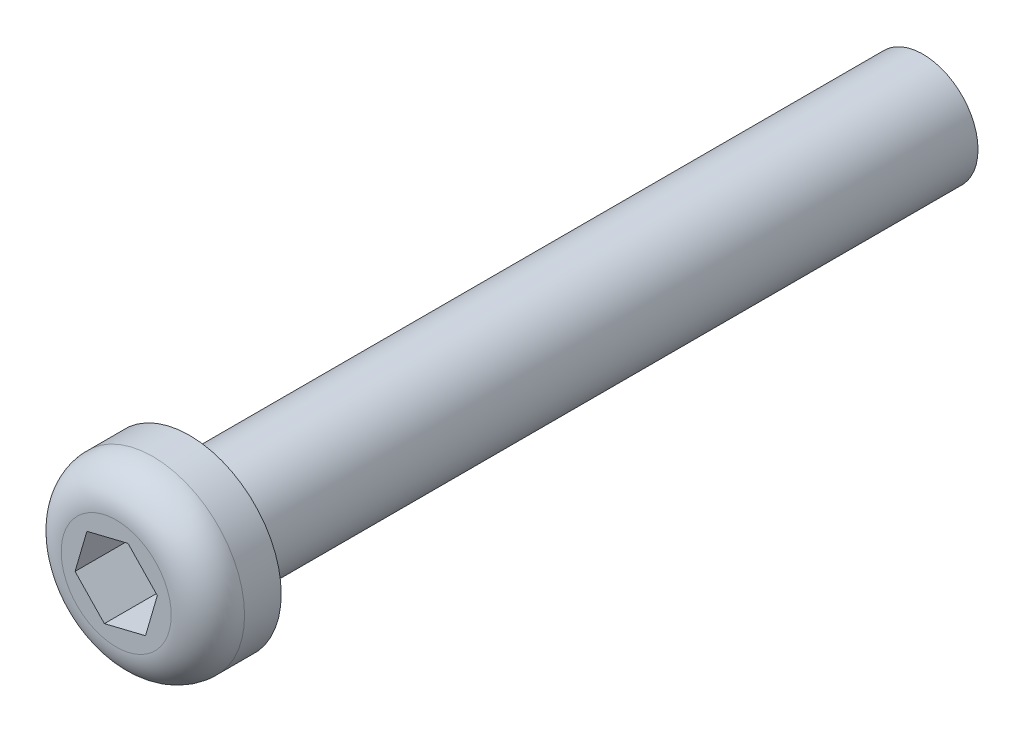
ISO-10303-21;
HEADER;
FILE_DESCRIPTION(('STEP AP214'),'2;1');
FILE_NAME('part.step','',(''),(''),'','','');
FILE_SCHEMA(('AUTOMOTIVE_DESIGN { 1 0 10303 214 1 1 1 1 }'));
ENDSEC;
DATA;
#1=APPLICATION_CONTEXT('core data for automotive mechanical design processes');
#2=APPLICATION_PROTOCOL_DEFINITION('international standard','automotive_design',2000,#1);
#3=PRODUCT_CONTEXT('',#1,'mechanical');
#4=PRODUCT('Part','Part','',(#3));
#5=PRODUCT_RELATED_PRODUCT_CATEGORY('part','',(#4));
#6=PRODUCT_DEFINITION_FORMATION('','',#4);
#7=PRODUCT_DEFINITION_CONTEXT('part definition',#1,'design');
#8=PRODUCT_DEFINITION('design','',#6,#7);
#9=PRODUCT_DEFINITION_SHAPE('','',#8);
#10=(LENGTH_UNIT() NAMED_UNIT(*) SI_UNIT(.MILLI.,.METRE.));
#11=(NAMED_UNIT(*) PLANE_ANGLE_UNIT() SI_UNIT($,.RADIAN.));
#12=(NAMED_UNIT(*) SI_UNIT($,.STERADIAN.) SOLID_ANGLE_UNIT());
#13=UNCERTAINTY_MEASURE_WITH_UNIT(LENGTH_MEASURE(1.E-05),#10,'distance_accuracy_value','');
#14=(GEOMETRIC_REPRESENTATION_CONTEXT(3) GLOBAL_UNCERTAINTY_ASSIGNED_CONTEXT((#13)) GLOBAL_UNIT_ASSIGNED_CONTEXT((#10,
#11,#12)) REPRESENTATION_CONTEXT('',''));
#15=CARTESIAN_POINT('',(0.,0.,0.));
#16=DIRECTION('',(0.,0.,1.));
#17=DIRECTION('',(1.,0.,0.));
#18=AXIS2_PLACEMENT_3D('',#15,#16,#17);
#19=CARTESIAN_POINT('',(0.,0.,20.));
#20=DIRECTION('',(0.,0.,-1.));
#21=DIRECTION('',(-1.,0.,0.));
#22=AXIS2_PLACEMENT_3D('',#19,#20,#21);
#23=CYLINDRICAL_SURFACE('',#22,1.5);
#24=CARTESIAN_POINT('',(0.,0.,20.));
#25=DIRECTION('',(0.,0.,1.));
#26=DIRECTION('',(1.,0.,0.));
#27=AXIS2_PLACEMENT_3D('',#24,#25,#26);
#28=CIRCLE('',#27,1.5);
#29=CARTESIAN_POINT('',(1.5,0.,20.));
#30=VERTEX_POINT('',#29);
#31=EDGE_CURVE('E168',#30,#30,#28,.T.);
#32=ORIENTED_EDGE('',*,*,#31,.F.);
#33=EDGE_LOOP('',(#32));
#34=FACE_BOUND('',#33,.T.);
#35=CARTESIAN_POINT('',(0.,0.,0.));
#36=DIRECTION('',(0.,0.,1.));
#37=DIRECTION('',(1.,0.,0.));
#38=AXIS2_PLACEMENT_3D('',#35,#36,#37);
#39=CIRCLE('',#38,1.5);
#40=CARTESIAN_POINT('',(1.5,0.,0.));
#41=VERTEX_POINT('',#40);
#42=EDGE_CURVE('E167',#41,#41,#39,.T.);
#43=ORIENTED_EDGE('',*,*,#42,.T.);
#44=EDGE_LOOP('',(#43));
#45=FACE_BOUND('',#44,.T.);
#46=ADVANCED_FACE('F39',(#34,#45),#23,.T.);
#47=CARTESIAN_POINT('',(0.,0.,0.));
#48=DIRECTION('',(0.,0.,1.));
#49=DIRECTION('',(1.,0.,0.));
#50=AXIS2_PLACEMENT_3D('',#47,#48,#49);
#51=PLANE('',#50);
#52=ORIENTED_EDGE('',*,*,#42,.F.);
#53=EDGE_LOOP('',(#52));
#54=FACE_BOUND('',#53,.T.);
#55=ADVANCED_FACE('F190',(#54),#51,.F.);
#56=CARTESIAN_POINT('',(0.,0.,22.));
#57=DIRECTION('',(0.,0.,-1.));
#58=DIRECTION('',(-1.,0.,0.));
#59=AXIS2_PLACEMENT_3D('',#56,#57,#58);
#60=CYLINDRICAL_SURFACE('',#59,2.5);
#61=CARTESIAN_POINT('',(0.,0.,21.));
#62=DIRECTION('',(0.,0.,1.));
#63=DIRECTION('',(1.,0.,0.));
#64=AXIS2_PLACEMENT_3D('',#61,#62,#63);
#65=CIRCLE('',#64,2.5);
#66=CARTESIAN_POINT('',(2.5,0.,21.));
#67=VERTEX_POINT('',#66);
#68=EDGE_CURVE('E11',#67,#67,#65,.F.);
#69=ORIENTED_EDGE('',*,*,#68,.T.);
#70=EDGE_LOOP('',(#69));
#71=FACE_BOUND('',#70,.T.);
#72=CARTESIAN_POINT('',(0.,0.,20.));
#73=DIRECTION('',(0.,0.,1.));
#74=DIRECTION('',(1.,0.,0.));
#75=AXIS2_PLACEMENT_3D('',#72,#73,#74);
#76=CIRCLE('',#75,2.5);
#77=CARTESIAN_POINT('',(2.5,0.,20.));
#78=VERTEX_POINT('',#77);
#79=EDGE_CURVE('E154',#78,#78,#76,.T.);
#80=ORIENTED_EDGE('',*,*,#79,.T.);
#81=EDGE_LOOP('',(#80));
#82=FACE_BOUND('',#81,.T.);
#83=ADVANCED_FACE('F195',(#71,#82),#60,.T.);
#84=CARTESIAN_POINT('',(0.,0.,22.));
#85=DIRECTION('',(0.,0.,1.));
#86=DIRECTION('',(1.,0.,0.));
#87=AXIS2_PLACEMENT_3D('',#84,#85,#86);
#88=PLANE('',#87);
#89=CARTESIAN_POINT('',(0.,0.,22.));
#90=DIRECTION('',(0.,0.,1.));
#91=DIRECTION('',(1.,0.,0.));
#92=AXIS2_PLACEMENT_3D('',#89,#90,#91);
#93=CIRCLE('',#92,1.5);
#94=CARTESIAN_POINT('',(1.5,0.,22.));
#95=VERTEX_POINT('',#94);
#96=EDGE_CURVE('E48',#95,#95,#93,.T.);
#97=ORIENTED_EDGE('',*,*,#96,.T.);
#98=EDGE_LOOP('',(#97));
#99=FACE_BOUND('',#98,.T.);
#100=DIRECTION('',(-0.691890801315472,0.722002160007181,0.));
#101=VECTOR('',#100,1.);
#102=CARTESIAN_POINT('',(1.12146550039649,0.275042659879835,22.));
#103=LINE('',#102,#101);
#104=CARTESIAN_POINT('',(1.12146550039649,0.275042659879835,22.));
#105=VERTEX_POINT('',#104);
#106=CARTESIAN_POINT('',(0.322538819617867,1.10873894275111,22.));
#107=VERTEX_POINT('',#106);
#108=EDGE_CURVE('E55',#105,#107,#103,.T.);
#109=ORIENTED_EDGE('',*,*,#108,.F.);
#110=DIRECTION('',(0.279326811495719,0.960196090587561,0.));
#111=VECTOR('',#110,1.);
#112=CARTESIAN_POINT('',(0.798926680778627,-0.833696282871273,22.));
#113=LINE('',#112,#111);
#114=CARTESIAN_POINT('',(0.798926680778627,-0.833696282871273,22.));
#115=VERTEX_POINT('',#114);
#116=EDGE_CURVE('E148',#115,#105,#113,.T.);
#117=ORIENTED_EDGE('',*,*,#116,.F.);
#118=DIRECTION('',(0.971217612811191,0.23819393058038,0.));
#119=VECTOR('',#118,1.);
#120=CARTESIAN_POINT('',(-0.322538819617868,-1.10873894275111,22.));
#121=LINE('',#120,#119);
#122=CARTESIAN_POINT('',(-0.322538819617868,-1.10873894275111,22.));
#123=VERTEX_POINT('',#122);
#124=EDGE_CURVE('E145',#123,#115,#121,.T.);
#125=ORIENTED_EDGE('',*,*,#124,.F.);
#126=DIRECTION('',(0.691890801315472,-0.72200216000718,0.));
#127=VECTOR('',#126,1.);
#128=CARTESIAN_POINT('',(-1.12146550039649,-0.275042659879836,22.));
#129=LINE('',#128,#127);
#130=CARTESIAN_POINT('',(-1.12146550039649,-0.275042659879836,22.));
#131=VERTEX_POINT('',#130);
#132=EDGE_CURVE('E103',#131,#123,#129,.T.);
#133=ORIENTED_EDGE('',*,*,#132,.F.);
#134=DIRECTION('',(-0.279326811495719,-0.960196090587561,0.));
#135=VECTOR('',#134,1.);
#136=CARTESIAN_POINT('',(-0.798926680778626,0.833696282871275,22.));
#137=LINE('',#136,#135);
#138=CARTESIAN_POINT('',(-0.798926680778626,0.833696282871275,22.));
#139=VERTEX_POINT('',#138);
#140=EDGE_CURVE('E139',#139,#131,#137,.T.);
#141=ORIENTED_EDGE('',*,*,#140,.F.);
#142=DIRECTION('',(-0.971217612811191,-0.23819393058038,0.));
#143=VECTOR('',#142,1.);
#144=CARTESIAN_POINT('',(0.322538819617867,1.10873894275111,22.));
#145=LINE('',#144,#143);
#146=EDGE_CURVE('E135',#107,#139,#145,.T.);
#147=ORIENTED_EDGE('',*,*,#146,.F.);
#148=EDGE_LOOP('',(#109,#117,#125,#133,#141,#147));
#149=FACE_BOUND('',#148,.T.);
#150=ADVANCED_FACE('F178',(#99,#149),#88,.T.);
#151=CARTESIAN_POINT('',(0.,0.,20.));
#152=DIRECTION('',(0.,0.,1.));
#153=DIRECTION('',(1.,0.,0.));
#154=AXIS2_PLACEMENT_3D('',#151,#152,#153);
#155=PLANE('',#154);
#156=ORIENTED_EDGE('',*,*,#31,.T.);
#157=EDGE_LOOP('',(#156));
#158=FACE_BOUND('',#157,.T.);
#159=ORIENTED_EDGE('',*,*,#79,.F.);
#160=EDGE_LOOP('',(#159));
#161=FACE_BOUND('',#160,.T.);
#162=ADVANCED_FACE('F204',(#158,#161),#155,.F.);
#163=CARTESIAN_POINT('',(1.12146550039649,0.275042659879835,20.5));
#164=DIRECTION('',(0.722002160007181,0.691890801315472,0.));
#165=DIRECTION('',(-0.691890801315472,0.722002160007181,0.));
#166=AXIS2_PLACEMENT_3D('',#163,#164,#165);
#167=PLANE('',#166);
#168=ORIENTED_EDGE('',*,*,#108,.T.);
#169=DIRECTION('',(0.,0.,1.));
#170=VECTOR('',#169,1.);
#171=CARTESIAN_POINT('',(0.322538819617867,1.10873894275111,20.5));
#172=LINE('',#171,#170);
#173=CARTESIAN_POINT('',(0.322538819617867,1.10873894275111,20.5));
#174=VERTEX_POINT('',#173);
#175=EDGE_CURVE('E85',#174,#107,#172,.T.);
#176=ORIENTED_EDGE('',*,*,#175,.F.);
#177=DIRECTION('',(-0.691890801315472,0.722002160007181,0.));
#178=VECTOR('',#177,1.);
#179=CARTESIAN_POINT('',(1.12146550039649,0.275042659879835,20.5));
#180=LINE('',#179,#178);
#181=CARTESIAN_POINT('',(1.12146550039649,0.275042659879835,20.5));
#182=VERTEX_POINT('',#181);
#183=EDGE_CURVE('E151',#182,#174,#180,.T.);
#184=ORIENTED_EDGE('',*,*,#183,.F.);
#185=DIRECTION('',(0.,0.,1.));
#186=VECTOR('',#185,1.);
#187=CARTESIAN_POINT('',(1.12146550039649,0.275042659879835,20.5));
#188=LINE('',#187,#186);
#189=EDGE_CURVE('E63',#182,#105,#188,.T.);
#190=ORIENTED_EDGE('',*,*,#189,.T.);
#191=EDGE_LOOP('',(#168,#176,#184,#190));
#192=FACE_BOUND('',#191,.T.);
#193=ADVANCED_FACE('F207',(#192),#167,.F.);
#194=CARTESIAN_POINT('',(0.798926680778627,-0.833696282871273,20.5));
#195=DIRECTION('',(0.960196090587561,-0.279326811495719,0.));
#196=DIRECTION('',(0.279326811495719,0.960196090587561,0.));
#197=AXIS2_PLACEMENT_3D('',#194,#195,#196);
#198=PLANE('',#197);
#199=ORIENTED_EDGE('',*,*,#116,.T.);
#200=ORIENTED_EDGE('',*,*,#189,.F.);
#201=DIRECTION('',(0.279326811495719,0.960196090587561,0.));
#202=VECTOR('',#201,1.);
#203=CARTESIAN_POINT('',(0.798926680778627,-0.833696282871273,20.5));
#204=LINE('',#203,#202);
#205=CARTESIAN_POINT('',(0.798926680778627,-0.833696282871273,20.5));
#206=VERTEX_POINT('',#205);
#207=EDGE_CURVE('E117',#206,#182,#204,.T.);
#208=ORIENTED_EDGE('',*,*,#207,.F.);
#209=DIRECTION('',(0.,0.,1.));
#210=VECTOR('',#209,1.);
#211=CARTESIAN_POINT('',(0.798926680778627,-0.833696282871273,20.5));
#212=LINE('',#211,#210);
#213=EDGE_CURVE('E108',#206,#115,#212,.T.);
#214=ORIENTED_EDGE('',*,*,#213,.T.);
#215=EDGE_LOOP('',(#199,#200,#208,#214));
#216=FACE_BOUND('',#215,.T.);
#217=ADVANCED_FACE('F213',(#216),#198,.F.);
#218=CARTESIAN_POINT('',(-0.322538819617868,-1.10873894275111,20.5));
#219=DIRECTION('',(0.23819393058038,-0.971217612811191,0.));
#220=DIRECTION('',(0.971217612811191,0.23819393058038,0.));
#221=AXIS2_PLACEMENT_3D('',#218,#219,#220);
#222=PLANE('',#221);
#223=ORIENTED_EDGE('',*,*,#124,.T.);
#224=ORIENTED_EDGE('',*,*,#213,.F.);
#225=DIRECTION('',(0.971217612811191,0.23819393058038,0.));
#226=VECTOR('',#225,1.);
#227=CARTESIAN_POINT('',(-0.322538819617868,-1.10873894275111,20.5));
#228=LINE('',#227,#226);
#229=CARTESIAN_POINT('',(-0.322538819617868,-1.10873894275111,20.5));
#230=VERTEX_POINT('',#229);
#231=EDGE_CURVE('E112',#230,#206,#228,.T.);
#232=ORIENTED_EDGE('',*,*,#231,.F.);
#233=DIRECTION('',(0.,0.,1.));
#234=VECTOR('',#233,1.);
#235=CARTESIAN_POINT('',(-0.322538819617868,-1.10873894275111,20.5));
#236=LINE('',#235,#234);
#237=EDGE_CURVE('E96',#230,#123,#236,.T.);
#238=ORIENTED_EDGE('',*,*,#237,.T.);
#239=EDGE_LOOP('',(#223,#224,#232,#238));
#240=FACE_BOUND('',#239,.T.);
#241=ADVANCED_FACE('F113',(#240),#222,.F.);
#242=CARTESIAN_POINT('',(-1.12146550039649,-0.275042659879836,20.5));
#243=DIRECTION('',(-0.72200216000718,-0.691890801315472,0.));
#244=DIRECTION('',(0.691890801315472,-0.72200216000718,0.));
#245=AXIS2_PLACEMENT_3D('',#242,#243,#244);
#246=PLANE('',#245);
#247=ORIENTED_EDGE('',*,*,#132,.T.);
#248=ORIENTED_EDGE('',*,*,#237,.F.);
#249=DIRECTION('',(0.691890801315472,-0.72200216000718,0.));
#250=VECTOR('',#249,1.);
#251=CARTESIAN_POINT('',(-1.12146550039649,-0.275042659879836,20.5));
#252=LINE('',#251,#250);
#253=CARTESIAN_POINT('',(-1.12146550039649,-0.275042659879836,20.5));
#254=VERTEX_POINT('',#253);
#255=EDGE_CURVE('E100',#254,#230,#252,.T.);
#256=ORIENTED_EDGE('',*,*,#255,.F.);
#257=DIRECTION('',(0.,0.,1.));
#258=VECTOR('',#257,1.);
#259=CARTESIAN_POINT('',(-1.12146550039649,-0.275042659879836,20.5));
#260=LINE('',#259,#258);
#261=EDGE_CURVE('E109',#254,#131,#260,.T.);
#262=ORIENTED_EDGE('',*,*,#261,.T.);
#263=EDGE_LOOP('',(#247,#248,#256,#262));
#264=FACE_BOUND('',#263,.T.);
#265=ADVANCED_FACE('F98',(#264),#246,.F.);
#266=CARTESIAN_POINT('',(-0.798926680778626,0.833696282871275,20.5));
#267=DIRECTION('',(-0.960196090587561,0.279326811495719,0.));
#268=DIRECTION('',(-0.279326811495719,-0.960196090587561,0.));
#269=AXIS2_PLACEMENT_3D('',#266,#267,#268);
#270=PLANE('',#269);
#271=ORIENTED_EDGE('',*,*,#140,.T.);
#272=ORIENTED_EDGE('',*,*,#261,.F.);
#273=DIRECTION('',(-0.279326811495719,-0.960196090587561,0.));
#274=VECTOR('',#273,1.);
#275=CARTESIAN_POINT('',(-0.798926680778626,0.833696282871275,20.5));
#276=LINE('',#275,#274);
#277=CARTESIAN_POINT('',(-0.798926680778626,0.833696282871275,20.5));
#278=VERTEX_POINT('',#277);
#279=EDGE_CURVE('E123',#278,#254,#276,.T.);
#280=ORIENTED_EDGE('',*,*,#279,.F.);
#281=DIRECTION('',(0.,0.,1.));
#282=VECTOR('',#281,1.);
#283=CARTESIAN_POINT('',(-0.798926680778626,0.833696282871275,20.5));
#284=LINE('',#283,#282);
#285=EDGE_CURVE('E159',#278,#139,#284,.T.);
#286=ORIENTED_EDGE('',*,*,#285,.T.);
#287=EDGE_LOOP('',(#271,#272,#280,#286));
#288=FACE_BOUND('',#287,.T.);
#289=ADVANCED_FACE('F216',(#288),#270,.F.);
#290=CARTESIAN_POINT('',(0.322538819617867,1.10873894275111,20.5));
#291=DIRECTION('',(-0.23819393058038,0.971217612811191,0.));
#292=DIRECTION('',(-0.971217612811191,-0.23819393058038,0.));
#293=AXIS2_PLACEMENT_3D('',#290,#291,#292);
#294=PLANE('',#293);
#295=ORIENTED_EDGE('',*,*,#146,.T.);
#296=ORIENTED_EDGE('',*,*,#285,.F.);
#297=DIRECTION('',(-0.971217612811191,-0.23819393058038,0.));
#298=VECTOR('',#297,1.);
#299=CARTESIAN_POINT('',(0.322538819617867,1.10873894275111,20.5));
#300=LINE('',#299,#298);
#301=EDGE_CURVE('E127',#174,#278,#300,.T.);
#302=ORIENTED_EDGE('',*,*,#301,.F.);
#303=ORIENTED_EDGE('',*,*,#175,.T.);
#304=EDGE_LOOP('',(#295,#296,#302,#303));
#305=FACE_BOUND('',#304,.T.);
#306=ADVANCED_FACE('F186',(#305),#294,.F.);
#307=CARTESIAN_POINT('',(0.,0.,20.5));
#308=DIRECTION('',(0.,0.,1.));
#309=DIRECTION('',(1.,0.,0.));
#310=AXIS2_PLACEMENT_3D('',#307,#308,#309);
#311=PLANE('',#310);
#312=ORIENTED_EDGE('',*,*,#183,.T.);
#313=ORIENTED_EDGE('',*,*,#301,.T.);
#314=ORIENTED_EDGE('',*,*,#279,.T.);
#315=ORIENTED_EDGE('',*,*,#255,.T.);
#316=ORIENTED_EDGE('',*,*,#231,.T.);
#317=ORIENTED_EDGE('',*,*,#207,.T.);
#318=EDGE_LOOP('',(#312,#313,#314,#315,#316,#317));
#319=FACE_BOUND('',#318,.T.);
#320=ADVANCED_FACE('F120',(#319),#311,.T.);
#321=CARTESIAN_POINT('',(0.,0.,21.));
#322=DIRECTION('',(0.,0.,1.));
#323=DIRECTION('',(1.,0.,0.));
#324=AXIS2_PLACEMENT_3D('',#321,#322,#323);
#325=TOROIDAL_SURFACE('',#324,1.5,1.);
#326=ORIENTED_EDGE('',*,*,#68,.F.);
#327=EDGE_LOOP('',(#326));
#328=FACE_BOUND('',#327,.T.);
#329=ORIENTED_EDGE('',*,*,#96,.F.);
#330=EDGE_LOOP('',(#329));
#331=FACE_BOUND('',#330,.T.);
#332=ADVANCED_FACE('F41',(#328,#331),#325,.T.);
#333=CLOSED_SHELL('',(#46,#55,#83,#150,#162,#193,#217,#241,#265,#289,#306,#320,#332));
#334=MANIFOLD_SOLID_BREP('B2',#333);
#335=ADVANCED_BREP_SHAPE_REPRESENTATION('',(#18,#334),#14);
#336=SHAPE_DEFINITION_REPRESENTATION(#9,#335);
ENDSEC;
END-ISO-10303-21;
